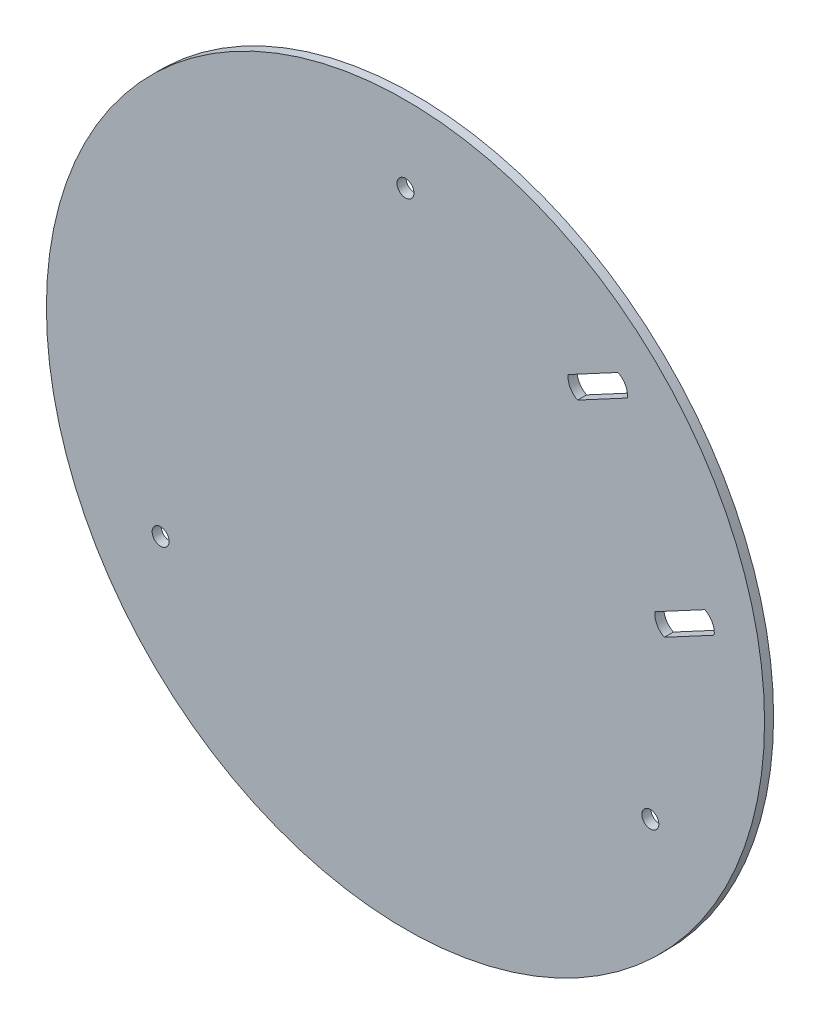
ISO-10303-21;
HEADER;
FILE_DESCRIPTION(('STEP AP214'),'2;1');
FILE_NAME('part.step','',(''),(''),'','','');
FILE_SCHEMA(('AUTOMOTIVE_DESIGN { 1 0 10303 214 1 1 1 1 }'));
ENDSEC;
DATA;
#1=APPLICATION_CONTEXT('core data for automotive mechanical design processes');
#2=APPLICATION_PROTOCOL_DEFINITION('international standard','automotive_design',2000,#1);
#3=PRODUCT_CONTEXT('',#1,'mechanical');
#4=PRODUCT('Part','Part','',(#3));
#5=PRODUCT_RELATED_PRODUCT_CATEGORY('part','',(#4));
#6=PRODUCT_DEFINITION_FORMATION('','',#4);
#7=PRODUCT_DEFINITION_CONTEXT('part definition',#1,'design');
#8=PRODUCT_DEFINITION('design','',#6,#7);
#9=PRODUCT_DEFINITION_SHAPE('','',#8);
#10=(LENGTH_UNIT() NAMED_UNIT(*) SI_UNIT(.MILLI.,.METRE.));
#11=(NAMED_UNIT(*) PLANE_ANGLE_UNIT() SI_UNIT($,.RADIAN.));
#12=(NAMED_UNIT(*) SI_UNIT($,.STERADIAN.) SOLID_ANGLE_UNIT());
#13=UNCERTAINTY_MEASURE_WITH_UNIT(LENGTH_MEASURE(1.E-05),#10,'distance_accuracy_value','');
#14=(GEOMETRIC_REPRESENTATION_CONTEXT(3) GLOBAL_UNCERTAINTY_ASSIGNED_CONTEXT((#13)) GLOBAL_UNIT_ASSIGNED_CONTEXT((#10,
#11,#12)) REPRESENTATION_CONTEXT('',''));
#15=CARTESIAN_POINT('',(0.,0.,0.));
#16=DIRECTION('',(0.,0.,1.));
#17=DIRECTION('',(1.,0.,0.));
#18=AXIS2_PLACEMENT_3D('',#15,#16,#17);
#19=CARTESIAN_POINT('',(0.,0.,1.6));
#20=DIRECTION('',(0.,0.,1.));
#21=DIRECTION('',(1.,0.,0.));
#22=AXIS2_PLACEMENT_3D('',#19,#20,#21);
#23=PLANE('',#22);
#24=CARTESIAN_POINT('',(0.,50.,1.6));
#25=DIRECTION('',(0.,0.,-1.));
#26=DIRECTION('',(-1.,0.,0.));
#27=AXIS2_PLACEMENT_3D('',#24,#25,#26);
#28=CIRCLE('',#27,1.5);
#29=CARTESIAN_POINT('',(-1.5,50.,1.6));
#30=VERTEX_POINT('',#29);
#31=EDGE_CURVE('E168',#30,#30,#28,.T.);
#32=ORIENTED_EDGE('',*,*,#31,.T.);
#33=EDGE_LOOP('',(#32));
#34=FACE_BOUND('',#33,.T.);
#35=CARTESIAN_POINT('',(43.3012701892187,-25.0000000000019,1.6));
#36=DIRECTION('',(0.,0.,-1.));
#37=DIRECTION('',(-1.,0.,0.));
#38=AXIS2_PLACEMENT_3D('',#35,#36,#37);
#39=CIRCLE('',#38,1.50000000000405);
#40=CARTESIAN_POINT('',(41.8012701892147,-25.0000000000019,1.6));
#41=VERTEX_POINT('',#40);
#42=EDGE_CURVE('E177',#41,#41,#39,.T.);
#43=ORIENTED_EDGE('',*,*,#42,.T.);
#44=EDGE_LOOP('',(#43));
#45=FACE_BOUND('',#44,.T.);
#46=CARTESIAN_POINT('',(-43.3012701892251,-24.9999999999982,1.6));
#47=DIRECTION('',(0.,0.,-1.));
#48=DIRECTION('',(-1.,0.,0.));
#49=AXIS2_PLACEMENT_3D('',#46,#47,#48);
#50=CIRCLE('',#49,1.50000000000274);
#51=CARTESIAN_POINT('',(-44.8012701892279,-24.9999999999982,1.6));
#52=VERTEX_POINT('',#51);
#53=EDGE_CURVE('E167',#52,#52,#50,.T.);
#54=ORIENTED_EDGE('',*,*,#53,.T.);
#55=EDGE_LOOP('',(#54));
#56=FACE_BOUND('',#55,.T.);
#57=CARTESIAN_POINT('',(0.,0.,1.6));
#58=DIRECTION('',(0.,0.,1.));
#59=DIRECTION('',(1.,0.,0.));
#60=AXIS2_PLACEMENT_3D('',#57,#58,#59);
#61=CIRCLE('',#60,63.5);
#62=CARTESIAN_POINT('',(63.5,0.,1.6));
#63=VERTEX_POINT('',#62);
#64=EDGE_CURVE('E11',#63,#63,#61,.T.);
#65=ORIENTED_EDGE('',*,*,#64,.T.);
#66=EDGE_LOOP('',(#65));
#67=FACE_BOUND('',#66,.T.);
#68=DIRECTION('',(0.881460712640204,0.472257357880026,0.));
#69=VECTOR('',#68,1.);
#70=CARTESIAN_POINT('',(-8.50063244184047,15.8662928275237,1.6));
#71=LINE('',#70,#69);
#72=CARTESIAN_POINT('',(28.7725515184467,35.8360261627023,1.6));
#73=VERTEX_POINT('',#72);
#74=CARTESIAN_POINT('',(37.5871586448488,40.5585997415026,1.6));
#75=VERTEX_POINT('',#74);
#76=EDGE_CURVE('E153',#73,#75,#71,.T.);
#77=ORIENTED_EDGE('',*,*,#76,.T.);
#78=CARTESIAN_POINT('',(36.2099572395383,37.8354000996822,1.6));
#79=DIRECTION('',(0.,0.,1.));
#80=DIRECTION('',(1.,0.,0.));
#81=AXIS2_PLACEMENT_3D('',#78,#79,#80);
#82=CIRCLE('',#81,3.05163890393342);
#83=CARTESIAN_POINT('',(39.2400593974289,37.4734872472619,1.6));
#84=VERTEX_POINT('',#83);
#85=EDGE_CURVE('E161',#75,#84,#82,.F.);
#86=ORIENTED_EDGE('',*,*,#85,.T.);
#87=DIRECTION('',(0.881460712640204,0.472257357880026,0.));
#88=VECTOR('',#87,1.);
#89=CARTESIAN_POINT('',(-6.84773168926038,12.781180333283,1.6));
#90=LINE('',#89,#88);
#91=CARTESIAN_POINT('',(30.4254522710268,32.7509136684616,1.6));
#92=VERTEX_POINT('',#91);
#93=EDGE_CURVE('E121',#92,#84,#90,.T.);
#94=ORIENTED_EDGE('',*,*,#93,.F.);
#95=CARTESIAN_POINT('',(31.8026536763373,35.474113310282,1.6));
#96=DIRECTION('',(0.,0.,1.));
#97=DIRECTION('',(1.,0.,0.));
#98=AXIS2_PLACEMENT_3D('',#95,#96,#97);
#99=CIRCLE('',#98,3.05163890393342);
#100=EDGE_CURVE('E159',#73,#92,#99,.T.);
#101=ORIENTED_EDGE('',*,*,#100,.F.);
#102=EDGE_LOOP('',(#77,#86,#94,#101));
#103=FACE_BOUND('',#102,.T.);
#104=DIRECTION('',(0.881460712640204,0.472257357880026,0.));
#105=VECTOR('',#104,1.);
#106=CARTESIAN_POINT('',(6.84773168926038,-12.781180333283,1.6));
#107=LINE('',#106,#105);
#108=CARTESIAN_POINT('',(44.1209156495476,7.18855300189569,1.6));
#109=VERTEX_POINT('',#108);
#110=CARTESIAN_POINT('',(52.9355227759496,11.911126580696,1.6));
#111=VERTEX_POINT('',#110);
#112=EDGE_CURVE('E157',#109,#111,#107,.T.);
#113=ORIENTED_EDGE('',*,*,#112,.T.);
#114=CARTESIAN_POINT('',(51.5583213706392,9.18792693887552,1.6));
#115=DIRECTION('',(0.,0.,1.));
#116=DIRECTION('',(1.,0.,0.));
#117=AXIS2_PLACEMENT_3D('',#114,#115,#116);
#118=CIRCLE('',#117,3.05163890393343);
#119=CARTESIAN_POINT('',(54.5884235285297,8.82601408645523,1.6));
#120=VERTEX_POINT('',#119);
#121=EDGE_CURVE('E120',#111,#120,#118,.F.);
#122=ORIENTED_EDGE('',*,*,#121,.T.);
#123=DIRECTION('',(0.881460712640204,0.472257357880027,0.));
#124=VECTOR('',#123,1.);
#125=CARTESIAN_POINT('',(8.50063244184048,-15.8662928275237,1.6));
#126=LINE('',#125,#124);
#127=CARTESIAN_POINT('',(45.7738164021277,4.10344050765497,1.6));
#128=VERTEX_POINT('',#127);
#129=EDGE_CURVE('E155',#128,#120,#126,.T.);
#130=ORIENTED_EDGE('',*,*,#129,.F.);
#131=CARTESIAN_POINT('',(47.1510178074381,6.82664014947539,1.6));
#132=DIRECTION('',(0.,0.,1.));
#133=DIRECTION('',(1.,0.,0.));
#134=AXIS2_PLACEMENT_3D('',#131,#132,#133);
#135=CIRCLE('',#134,3.05163890393343);
#136=EDGE_CURVE('E164',#109,#128,#135,.T.);
#137=ORIENTED_EDGE('',*,*,#136,.F.);
#138=EDGE_LOOP('',(#113,#122,#130,#137));
#139=FACE_BOUND('',#138,.T.);
#140=ADVANCED_FACE('F35',(#34,#45,#56,#67,#103,#139),#23,.T.);
#141=CARTESIAN_POINT('',(0.,0.,0.));
#142=DIRECTION('',(0.,0.,1.));
#143=DIRECTION('',(1.,0.,0.));
#144=AXIS2_PLACEMENT_3D('',#141,#142,#143);
#145=PLANE('',#144);
#146=CARTESIAN_POINT('',(0.,50.,0.));
#147=DIRECTION('',(0.,0.,-1.));
#148=DIRECTION('',(-1.,0.,0.));
#149=AXIS2_PLACEMENT_3D('',#146,#147,#148);
#150=CIRCLE('',#149,1.5);
#151=CARTESIAN_POINT('',(-1.5,50.,0.));
#152=VERTEX_POINT('',#151);
#153=EDGE_CURVE('E171',#152,#152,#150,.T.);
#154=ORIENTED_EDGE('',*,*,#153,.F.);
#155=EDGE_LOOP('',(#154));
#156=FACE_BOUND('',#155,.T.);
#157=CARTESIAN_POINT('',(43.3012701892187,-25.0000000000019,0.));
#158=DIRECTION('',(0.,0.,-1.));
#159=DIRECTION('',(-1.,0.,0.));
#160=AXIS2_PLACEMENT_3D('',#157,#158,#159);
#161=CIRCLE('',#160,1.50000000000405);
#162=CARTESIAN_POINT('',(41.8012701892147,-25.0000000000019,0.));
#163=VERTEX_POINT('',#162);
#164=EDGE_CURVE('E174',#163,#163,#161,.T.);
#165=ORIENTED_EDGE('',*,*,#164,.F.);
#166=EDGE_LOOP('',(#165));
#167=FACE_BOUND('',#166,.T.);
#168=CARTESIAN_POINT('',(-43.3012701892251,-24.9999999999982,0.));
#169=DIRECTION('',(0.,0.,-1.));
#170=DIRECTION('',(-1.,0.,0.));
#171=AXIS2_PLACEMENT_3D('',#168,#169,#170);
#172=CIRCLE('',#171,1.50000000000274);
#173=CARTESIAN_POINT('',(-44.8012701892279,-24.9999999999982,0.));
#174=VERTEX_POINT('',#173);
#175=EDGE_CURVE('E180',#174,#174,#172,.T.);
#176=ORIENTED_EDGE('',*,*,#175,.F.);
#177=EDGE_LOOP('',(#176));
#178=FACE_BOUND('',#177,.T.);
#179=CARTESIAN_POINT('',(0.,0.,0.));
#180=DIRECTION('',(0.,0.,1.));
#181=DIRECTION('',(1.,0.,0.));
#182=AXIS2_PLACEMENT_3D('',#179,#180,#181);
#183=CIRCLE('',#182,63.5);
#184=CARTESIAN_POINT('',(63.5,0.,0.));
#185=VERTEX_POINT('',#184);
#186=EDGE_CURVE('E39',#185,#185,#183,.T.);
#187=ORIENTED_EDGE('',*,*,#186,.F.);
#188=EDGE_LOOP('',(#187));
#189=FACE_BOUND('',#188,.T.);
#190=CARTESIAN_POINT('',(36.2099572395383,37.8354000996822,0.));
#191=DIRECTION('',(0.,0.,1.));
#192=DIRECTION('',(1.,0.,0.));
#193=AXIS2_PLACEMENT_3D('',#190,#191,#192);
#194=CIRCLE('',#193,3.05163890393342);
#195=CARTESIAN_POINT('',(39.2400593974289,37.4734872472619,0.));
#196=VERTEX_POINT('',#195);
#197=CARTESIAN_POINT('',(37.5871586448488,40.5585997415026,0.));
#198=VERTEX_POINT('',#197);
#199=EDGE_CURVE('E124',#196,#198,#194,.T.);
#200=ORIENTED_EDGE('',*,*,#199,.T.);
#201=DIRECTION('',(-0.881460712640204,-0.472257357880026,0.));
#202=VECTOR('',#201,1.);
#203=CARTESIAN_POINT('',(37.5871586448488,40.5585997415026,0.));
#204=LINE('',#203,#202);
#205=CARTESIAN_POINT('',(28.7725515184467,35.8360261627023,0.));
#206=VERTEX_POINT('',#205);
#207=EDGE_CURVE('E126',#198,#206,#204,.T.);
#208=ORIENTED_EDGE('',*,*,#207,.T.);
#209=CARTESIAN_POINT('',(31.8026536763373,35.474113310282,0.));
#210=DIRECTION('',(0.,0.,-1.));
#211=DIRECTION('',(-1.,0.,0.));
#212=AXIS2_PLACEMENT_3D('',#209,#210,#211);
#213=CIRCLE('',#212,3.05163890393342);
#214=CARTESIAN_POINT('',(30.4254522710268,32.7509136684616,0.));
#215=VERTEX_POINT('',#214);
#216=EDGE_CURVE('E147',#215,#206,#213,.T.);
#217=ORIENTED_EDGE('',*,*,#216,.F.);
#218=DIRECTION('',(-0.881460712640204,-0.472257357880026,0.));
#219=VECTOR('',#218,1.);
#220=CARTESIAN_POINT('',(39.2400593974289,37.4734872472619,0.));
#221=LINE('',#220,#219);
#222=EDGE_CURVE('E58',#196,#215,#221,.T.);
#223=ORIENTED_EDGE('',*,*,#222,.F.);
#224=EDGE_LOOP('',(#200,#208,#217,#223));
#225=FACE_BOUND('',#224,.T.);
#226=CARTESIAN_POINT('',(51.5583213706392,9.18792693887552,0.));
#227=DIRECTION('',(0.,0.,1.));
#228=DIRECTION('',(1.,0.,0.));
#229=AXIS2_PLACEMENT_3D('',#226,#227,#228);
#230=CIRCLE('',#229,3.05163890393343);
#231=CARTESIAN_POINT('',(54.5884235285297,8.82601408645523,0.));
#232=VERTEX_POINT('',#231);
#233=CARTESIAN_POINT('',(52.9355227759496,11.911126580696,0.));
#234=VERTEX_POINT('',#233);
#235=EDGE_CURVE('E112',#232,#234,#230,.T.);
#236=ORIENTED_EDGE('',*,*,#235,.T.);
#237=DIRECTION('',(-0.881460712640204,-0.472257357880026,0.));
#238=VECTOR('',#237,1.);
#239=CARTESIAN_POINT('',(52.9355227759496,11.911126580696,0.));
#240=LINE('',#239,#238);
#241=CARTESIAN_POINT('',(44.1209156495476,7.18855300189569,0.));
#242=VERTEX_POINT('',#241);
#243=EDGE_CURVE('E104',#234,#242,#240,.T.);
#244=ORIENTED_EDGE('',*,*,#243,.T.);
#245=CARTESIAN_POINT('',(47.1510178074381,6.82664014947539,0.));
#246=DIRECTION('',(0.,0.,-1.));
#247=DIRECTION('',(-1.,0.,0.));
#248=AXIS2_PLACEMENT_3D('',#245,#246,#247);
#249=CIRCLE('',#248,3.05163890393343);
#250=CARTESIAN_POINT('',(45.7738164021277,4.10344050765497,0.));
#251=VERTEX_POINT('',#250);
#252=EDGE_CURVE('E111',#251,#242,#249,.T.);
#253=ORIENTED_EDGE('',*,*,#252,.F.);
#254=DIRECTION('',(-0.881460712640204,-0.472257357880027,0.));
#255=VECTOR('',#254,1.);
#256=CARTESIAN_POINT('',(54.5884235285297,8.82601408645523,0.));
#257=LINE('',#256,#255);
#258=EDGE_CURVE('E50',#232,#251,#257,.T.);
#259=ORIENTED_EDGE('',*,*,#258,.F.);
#260=EDGE_LOOP('',(#236,#244,#253,#259));
#261=FACE_BOUND('',#260,.T.);
#262=ADVANCED_FACE('F123',(#156,#167,#178,#189,#225,#261),#145,.F.);
#263=CARTESIAN_POINT('',(0.,0.,1.6));
#264=DIRECTION('',(0.,0.,-1.));
#265=DIRECTION('',(-1.,0.,0.));
#266=AXIS2_PLACEMENT_3D('',#263,#264,#265);
#267=CYLINDRICAL_SURFACE('',#266,63.5);
#268=ORIENTED_EDGE('',*,*,#64,.F.);
#269=EDGE_LOOP('',(#268));
#270=FACE_BOUND('',#269,.T.);
#271=ORIENTED_EDGE('',*,*,#186,.T.);
#272=EDGE_LOOP('',(#271));
#273=FACE_BOUND('',#272,.T.);
#274=ADVANCED_FACE('F37',(#270,#273),#267,.T.);
#275=CARTESIAN_POINT('',(-43.3012701892251,-24.9999999999982,1.6));
#276=DIRECTION('',(0.,0.,-1.));
#277=DIRECTION('',(-1.,0.,0.));
#278=AXIS2_PLACEMENT_3D('',#275,#276,#277);
#279=CYLINDRICAL_SURFACE('',#278,1.50000000000274);
#280=ORIENTED_EDGE('',*,*,#53,.F.);
#281=EDGE_LOOP('',(#280));
#282=FACE_BOUND('',#281,.T.);
#283=ORIENTED_EDGE('',*,*,#175,.T.);
#284=EDGE_LOOP('',(#283));
#285=FACE_BOUND('',#284,.T.);
#286=ADVANCED_FACE('F188',(#282,#285),#279,.F.);
#287=CARTESIAN_POINT('',(43.3012701892187,-25.0000000000019,1.6));
#288=DIRECTION('',(0.,0.,-1.));
#289=DIRECTION('',(-1.,0.,0.));
#290=AXIS2_PLACEMENT_3D('',#287,#288,#289);
#291=CYLINDRICAL_SURFACE('',#290,1.50000000000405);
#292=ORIENTED_EDGE('',*,*,#42,.F.);
#293=EDGE_LOOP('',(#292));
#294=FACE_BOUND('',#293,.T.);
#295=ORIENTED_EDGE('',*,*,#164,.T.);
#296=EDGE_LOOP('',(#295));
#297=FACE_BOUND('',#296,.T.);
#298=ADVANCED_FACE('F191',(#294,#297),#291,.F.);
#299=CARTESIAN_POINT('',(0.,50.,1.6));
#300=DIRECTION('',(0.,0.,-1.));
#301=DIRECTION('',(-1.,0.,0.));
#302=AXIS2_PLACEMENT_3D('',#299,#300,#301);
#303=CYLINDRICAL_SURFACE('',#302,1.5);
#304=ORIENTED_EDGE('',*,*,#31,.F.);
#305=EDGE_LOOP('',(#304));
#306=FACE_BOUND('',#305,.T.);
#307=ORIENTED_EDGE('',*,*,#153,.T.);
#308=EDGE_LOOP('',(#307));
#309=FACE_BOUND('',#308,.T.);
#310=ADVANCED_FACE('F238',(#306,#309),#303,.F.);
#311=CARTESIAN_POINT('',(37.5871586448488,40.5585997415026,10.));
#312=DIRECTION('',(0.472257357880026,-0.881460712640204,0.));
#313=DIRECTION('',(0.881460712640204,0.472257357880026,0.));
#314=AXIS2_PLACEMENT_3D('',#311,#312,#313);
#315=PLANE('',#314);
#316=DIRECTION('',(0.,0.,-1.));
#317=VECTOR('',#316,1.);
#318=CARTESIAN_POINT('',(28.7725515184467,35.8360261627023,10.));
#319=LINE('',#318,#317);
#320=EDGE_CURVE('E139',#73,#206,#319,.T.);
#321=ORIENTED_EDGE('',*,*,#320,.T.);
#322=ORIENTED_EDGE('',*,*,#207,.F.);
#323=DIRECTION('',(0.,0.,-1.));
#324=VECTOR('',#323,1.);
#325=CARTESIAN_POINT('',(37.5871586448488,40.5585997415026,10.));
#326=LINE('',#325,#324);
#327=EDGE_CURVE('E136',#75,#198,#326,.T.);
#328=ORIENTED_EDGE('',*,*,#327,.F.);
#329=ORIENTED_EDGE('',*,*,#76,.F.);
#330=EDGE_LOOP('',(#321,#322,#328,#329));
#331=FACE_BOUND('',#330,.T.);
#332=ADVANCED_FACE('F213',(#331),#315,.T.);
#333=CARTESIAN_POINT('',(39.2400593974289,37.4734872472619,10.));
#334=DIRECTION('',(0.472257357880026,-0.881460712640204,0.));
#335=DIRECTION('',(0.881460712640204,0.472257357880026,0.));
#336=AXIS2_PLACEMENT_3D('',#333,#334,#335);
#337=PLANE('',#336);
#338=ORIENTED_EDGE('',*,*,#93,.T.);
#339=DIRECTION('',(0.,0.,-1.));
#340=VECTOR('',#339,1.);
#341=CARTESIAN_POINT('',(39.2400593974289,37.4734872472619,10.));
#342=LINE('',#341,#340);
#343=EDGE_CURVE('E143',#84,#196,#342,.T.);
#344=ORIENTED_EDGE('',*,*,#343,.T.);
#345=ORIENTED_EDGE('',*,*,#222,.T.);
#346=DIRECTION('',(0.,0.,-1.));
#347=VECTOR('',#346,1.);
#348=CARTESIAN_POINT('',(30.4254522710268,32.7509136684616,10.));
#349=LINE('',#348,#347);
#350=EDGE_CURVE('E141',#92,#215,#349,.T.);
#351=ORIENTED_EDGE('',*,*,#350,.F.);
#352=EDGE_LOOP('',(#338,#344,#345,#351));
#353=FACE_BOUND('',#352,.T.);
#354=ADVANCED_FACE('F206',(#353),#337,.F.);
#355=CARTESIAN_POINT('',(36.2099572395383,37.8354000996822,10.));
#356=DIRECTION('',(0.,0.,-1.));
#357=DIRECTION('',(-1.,0.,0.));
#358=AXIS2_PLACEMENT_3D('',#355,#356,#357);
#359=CYLINDRICAL_SURFACE('',#358,3.05163890393342);
#360=ORIENTED_EDGE('',*,*,#327,.T.);
#361=ORIENTED_EDGE('',*,*,#199,.F.);
#362=ORIENTED_EDGE('',*,*,#343,.F.);
#363=ORIENTED_EDGE('',*,*,#85,.F.);
#364=EDGE_LOOP('',(#360,#361,#362,#363));
#365=FACE_BOUND('',#364,.T.);
#366=ADVANCED_FACE('F202',(#365),#359,.F.);
#367=CARTESIAN_POINT('',(31.8026536763373,35.474113310282,10.));
#368=DIRECTION('',(0.,0.,-1.));
#369=DIRECTION('',(-1.,0.,0.));
#370=AXIS2_PLACEMENT_3D('',#367,#368,#369);
#371=CYLINDRICAL_SURFACE('',#370,3.05163890393342);
#372=ORIENTED_EDGE('',*,*,#100,.T.);
#373=ORIENTED_EDGE('',*,*,#350,.T.);
#374=ORIENTED_EDGE('',*,*,#216,.T.);
#375=ORIENTED_EDGE('',*,*,#320,.F.);
#376=EDGE_LOOP('',(#372,#373,#374,#375));
#377=FACE_BOUND('',#376,.T.);
#378=ADVANCED_FACE('F216',(#377),#371,.F.);
#379=CARTESIAN_POINT('',(52.9355227759496,11.911126580696,10.));
#380=DIRECTION('',(0.472257357880026,-0.881460712640204,0.));
#381=DIRECTION('',(0.881460712640204,0.472257357880026,0.));
#382=AXIS2_PLACEMENT_3D('',#379,#380,#381);
#383=PLANE('',#382);
#384=DIRECTION('',(0.,0.,-1.));
#385=VECTOR('',#384,1.);
#386=CARTESIAN_POINT('',(44.1209156495476,7.18855300189569,10.));
#387=LINE('',#386,#385);
#388=EDGE_CURVE('E109',#109,#242,#387,.T.);
#389=ORIENTED_EDGE('',*,*,#388,.T.);
#390=ORIENTED_EDGE('',*,*,#243,.F.);
#391=DIRECTION('',(0.,0.,-1.));
#392=VECTOR('',#391,1.);
#393=CARTESIAN_POINT('',(52.9355227759496,11.911126580696,10.));
#394=LINE('',#393,#392);
#395=EDGE_CURVE('E107',#111,#234,#394,.T.);
#396=ORIENTED_EDGE('',*,*,#395,.F.);
#397=ORIENTED_EDGE('',*,*,#112,.F.);
#398=EDGE_LOOP('',(#389,#390,#396,#397));
#399=FACE_BOUND('',#398,.T.);
#400=ADVANCED_FACE('F106',(#399),#383,.T.);
#401=CARTESIAN_POINT('',(54.5884235285297,8.82601408645523,10.));
#402=DIRECTION('',(0.472257357880027,-0.881460712640204,0.));
#403=DIRECTION('',(0.881460712640204,0.472257357880027,0.));
#404=AXIS2_PLACEMENT_3D('',#401,#402,#403);
#405=PLANE('',#404);
#406=ORIENTED_EDGE('',*,*,#129,.T.);
#407=DIRECTION('',(0.,0.,-1.));
#408=VECTOR('',#407,1.);
#409=CARTESIAN_POINT('',(54.5884235285297,8.82601408645523,10.));
#410=LINE('',#409,#408);
#411=EDGE_CURVE('E131',#120,#232,#410,.T.);
#412=ORIENTED_EDGE('',*,*,#411,.T.);
#413=ORIENTED_EDGE('',*,*,#258,.T.);
#414=DIRECTION('',(0.,0.,-1.));
#415=VECTOR('',#414,1.);
#416=CARTESIAN_POINT('',(45.7738164021277,4.10344050765497,10.));
#417=LINE('',#416,#415);
#418=EDGE_CURVE('E133',#128,#251,#417,.T.);
#419=ORIENTED_EDGE('',*,*,#418,.F.);
#420=EDGE_LOOP('',(#406,#412,#413,#419));
#421=FACE_BOUND('',#420,.T.);
#422=ADVANCED_FACE('F223',(#421),#405,.F.);
#423=CARTESIAN_POINT('',(51.5583213706392,9.18792693887552,10.));
#424=DIRECTION('',(0.,0.,-1.));
#425=DIRECTION('',(-1.,0.,0.));
#426=AXIS2_PLACEMENT_3D('',#423,#424,#425);
#427=CYLINDRICAL_SURFACE('',#426,3.05163890393343);
#428=ORIENTED_EDGE('',*,*,#395,.T.);
#429=ORIENTED_EDGE('',*,*,#235,.F.);
#430=ORIENTED_EDGE('',*,*,#411,.F.);
#431=ORIENTED_EDGE('',*,*,#121,.F.);
#432=EDGE_LOOP('',(#428,#429,#430,#431));
#433=FACE_BOUND('',#432,.T.);
#434=ADVANCED_FACE('F116',(#433),#427,.F.);
#435=CARTESIAN_POINT('',(47.1510178074381,6.82664014947539,10.));
#436=DIRECTION('',(0.,0.,-1.));
#437=DIRECTION('',(-1.,0.,0.));
#438=AXIS2_PLACEMENT_3D('',#435,#436,#437);
#439=CYLINDRICAL_SURFACE('',#438,3.05163890393343);
#440=ORIENTED_EDGE('',*,*,#136,.T.);
#441=ORIENTED_EDGE('',*,*,#418,.T.);
#442=ORIENTED_EDGE('',*,*,#252,.T.);
#443=ORIENTED_EDGE('',*,*,#388,.F.);
#444=EDGE_LOOP('',(#440,#441,#442,#443));
#445=FACE_BOUND('',#444,.T.);
#446=ADVANCED_FACE('F250',(#445),#439,.F.);
#447=CLOSED_SHELL('',(#140,#262,#274,#286,#298,#310,#332,#354,#366,#378,#400,#422,#434,#446));
#448=MANIFOLD_SOLID_BREP('B2',#447);
#449=ADVANCED_BREP_SHAPE_REPRESENTATION('',(#18,#448),#14);
#450=SHAPE_DEFINITION_REPRESENTATION(#9,#449);
ENDSEC;
END-ISO-10303-21;
